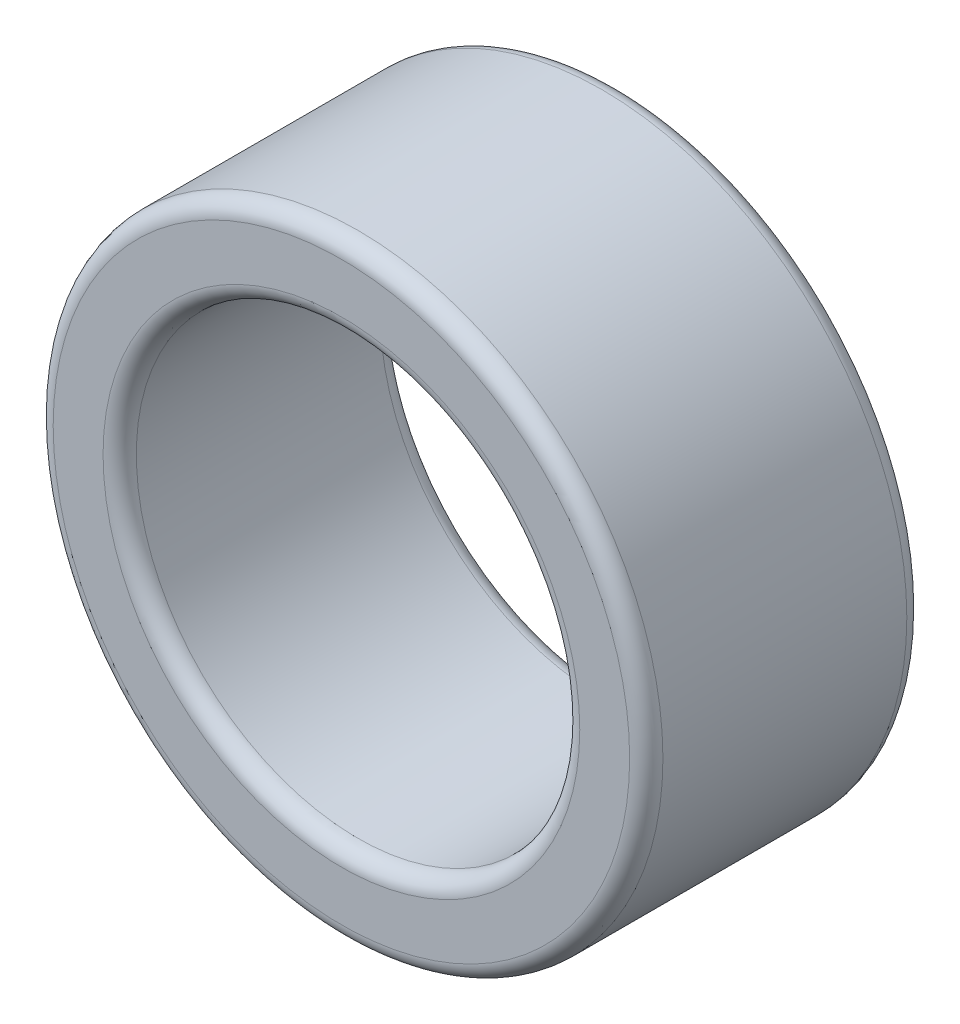
ISO-10303-21;
HEADER;
FILE_DESCRIPTION(('STEP AP214'),'2;1');
FILE_NAME('part.step','',(''),(''),'','','');
FILE_SCHEMA(('AUTOMOTIVE_DESIGN { 1 0 10303 214 1 1 1 1 }'));
ENDSEC;
DATA;
#1=APPLICATION_CONTEXT('core data for automotive mechanical design processes');
#2=APPLICATION_PROTOCOL_DEFINITION('international standard','automotive_design',2000,#1);
#3=PRODUCT_CONTEXT('',#1,'mechanical');
#4=PRODUCT('Part','Part','',(#3));
#5=PRODUCT_RELATED_PRODUCT_CATEGORY('part','',(#4));
#6=PRODUCT_DEFINITION_FORMATION('','',#4);
#7=PRODUCT_DEFINITION_CONTEXT('part definition',#1,'design');
#8=PRODUCT_DEFINITION('design','',#6,#7);
#9=PRODUCT_DEFINITION_SHAPE('','',#8);
#10=(LENGTH_UNIT() NAMED_UNIT(*) SI_UNIT(.MILLI.,.METRE.));
#11=(NAMED_UNIT(*) PLANE_ANGLE_UNIT() SI_UNIT($,.RADIAN.));
#12=(NAMED_UNIT(*) SI_UNIT($,.STERADIAN.) SOLID_ANGLE_UNIT());
#13=UNCERTAINTY_MEASURE_WITH_UNIT(LENGTH_MEASURE(1.E-05),#10,'distance_accuracy_value','');
#14=(GEOMETRIC_REPRESENTATION_CONTEXT(3) GLOBAL_UNCERTAINTY_ASSIGNED_CONTEXT((#13)) GLOBAL_UNIT_ASSIGNED_CONTEXT((#10,
#11,#12)) REPRESENTATION_CONTEXT('',''));
#15=CARTESIAN_POINT('',(0.,0.,0.));
#16=DIRECTION('',(0.,0.,1.));
#17=DIRECTION('',(1.,0.,0.));
#18=AXIS2_PLACEMENT_3D('',#15,#16,#17);
#19=CARTESIAN_POINT('',(0.,0.,5.));
#20=DIRECTION('',(0.,0.,1.));
#21=DIRECTION('',(1.,0.,0.));
#22=AXIS2_PLACEMENT_3D('',#19,#20,#21);
#23=PLANE('',#22);
#24=CARTESIAN_POINT('',(0.,0.,5.));
#25=DIRECTION('',(0.,0.,1.));
#26=DIRECTION('',(1.,0.,0.));
#27=AXIS2_PLACEMENT_3D('',#24,#25,#26);
#28=CIRCLE('',#27,4.3);
#29=CARTESIAN_POINT('',(4.3,0.,5.));
#30=VERTEX_POINT('',#29);
#31=EDGE_CURVE('E44',#30,#30,#28,.F.);
#32=ORIENTED_EDGE('',*,*,#31,.T.);
#33=EDGE_LOOP('',(#32));
#34=FACE_BOUND('',#33,.T.);
#35=CARTESIAN_POINT('',(0.,0.,5.));
#36=DIRECTION('',(0.,0.,1.));
#37=DIRECTION('',(1.,0.,0.));
#38=AXIS2_PLACEMENT_3D('',#35,#36,#37);
#39=CIRCLE('',#38,5.2);
#40=CARTESIAN_POINT('',(5.2,0.,5.));
#41=VERTEX_POINT('',#40);
#42=EDGE_CURVE('E49',#41,#41,#39,.T.);
#43=ORIENTED_EDGE('',*,*,#42,.T.);
#44=EDGE_LOOP('',(#43));
#45=FACE_BOUND('',#44,.T.);
#46=ADVANCED_FACE('F36',(#34,#45),#23,.T.);
#47=CARTESIAN_POINT('',(0.,0.,0.));
#48=DIRECTION('',(0.,0.,1.));
#49=DIRECTION('',(1.,0.,0.));
#50=AXIS2_PLACEMENT_3D('',#47,#48,#49);
#51=PLANE('',#50);
#52=CARTESIAN_POINT('',(0.,0.,0.));
#53=DIRECTION('',(0.,0.,1.));
#54=DIRECTION('',(1.,0.,0.));
#55=AXIS2_PLACEMENT_3D('',#52,#53,#54);
#56=CIRCLE('',#55,4.3);
#57=CARTESIAN_POINT('',(4.3,0.,0.));
#58=VERTEX_POINT('',#57);
#59=EDGE_CURVE('E64',#58,#58,#56,.T.);
#60=ORIENTED_EDGE('',*,*,#59,.T.);
#61=EDGE_LOOP('',(#60));
#62=FACE_BOUND('',#61,.T.);
#63=CARTESIAN_POINT('',(0.,0.,0.));
#64=DIRECTION('',(0.,0.,1.));
#65=DIRECTION('',(1.,0.,0.));
#66=AXIS2_PLACEMENT_3D('',#63,#64,#65);
#67=CIRCLE('',#66,5.2);
#68=CARTESIAN_POINT('',(5.2,0.,0.));
#69=VERTEX_POINT('',#68);
#70=EDGE_CURVE('E68',#69,#69,#67,.F.);
#71=ORIENTED_EDGE('',*,*,#70,.T.);
#72=EDGE_LOOP('',(#71));
#73=FACE_BOUND('',#72,.T.);
#74=ADVANCED_FACE('F98',(#62,#73),#51,.F.);
#75=CARTESIAN_POINT('',(0.,0.,5.));
#76=DIRECTION('',(0.,0.,-1.));
#77=DIRECTION('',(-1.,0.,0.));
#78=AXIS2_PLACEMENT_3D('',#75,#76,#77);
#79=CYLINDRICAL_SURFACE('',#78,5.5);
#80=CARTESIAN_POINT('',(0.,0.,4.7));
#81=DIRECTION('',(0.,0.,1.));
#82=DIRECTION('',(1.,0.,0.));
#83=AXIS2_PLACEMENT_3D('',#80,#81,#82);
#84=CIRCLE('',#83,5.5);
#85=CARTESIAN_POINT('',(5.5,0.,4.7));
#86=VERTEX_POINT('',#85);
#87=EDGE_CURVE('E10',#86,#86,#84,.F.);
#88=ORIENTED_EDGE('',*,*,#87,.T.);
#89=EDGE_LOOP('',(#88));
#90=FACE_BOUND('',#89,.T.);
#91=CARTESIAN_POINT('',(0.,0.,0.3));
#92=DIRECTION('',(0.,0.,1.));
#93=DIRECTION('',(1.,0.,0.));
#94=AXIS2_PLACEMENT_3D('',#91,#92,#93);
#95=CIRCLE('',#94,5.5);
#96=CARTESIAN_POINT('',(5.5,0.,0.3));
#97=VERTEX_POINT('',#96);
#98=EDGE_CURVE('E72',#97,#97,#95,.T.);
#99=ORIENTED_EDGE('',*,*,#98,.T.);
#100=EDGE_LOOP('',(#99));
#101=FACE_BOUND('',#100,.T.);
#102=ADVANCED_FACE('F77',(#90,#101),#79,.T.);
#103=CARTESIAN_POINT('',(0.,0.,5.));
#104=DIRECTION('',(0.,0.,-1.));
#105=DIRECTION('',(-1.,0.,0.));
#106=AXIS2_PLACEMENT_3D('',#103,#104,#105);
#107=CYLINDRICAL_SURFACE('',#106,4.);
#108=CARTESIAN_POINT('',(0.,0.,4.7));
#109=DIRECTION('',(0.,0.,1.));
#110=DIRECTION('',(1.,0.,0.));
#111=AXIS2_PLACEMENT_3D('',#108,#109,#110);
#112=CIRCLE('',#111,4.);
#113=CARTESIAN_POINT('',(4.,0.,4.7));
#114=VERTEX_POINT('',#113);
#115=EDGE_CURVE('E54',#114,#114,#112,.T.);
#116=ORIENTED_EDGE('',*,*,#115,.T.);
#117=EDGE_LOOP('',(#116));
#118=FACE_BOUND('',#117,.T.);
#119=CARTESIAN_POINT('',(0.,0.,0.3));
#120=DIRECTION('',(0.,0.,1.));
#121=DIRECTION('',(1.,0.,0.));
#122=AXIS2_PLACEMENT_3D('',#119,#120,#121);
#123=CIRCLE('',#122,4.);
#124=CARTESIAN_POINT('',(4.,0.,0.3));
#125=VERTEX_POINT('',#124);
#126=EDGE_CURVE('E60',#125,#125,#123,.F.);
#127=ORIENTED_EDGE('',*,*,#126,.T.);
#128=EDGE_LOOP('',(#127));
#129=FACE_BOUND('',#128,.T.);
#130=ADVANCED_FACE('F82',(#118,#129),#107,.F.);
#131=CARTESIAN_POINT('',(0.,0.,0.3));
#132=DIRECTION('',(0.,0.,1.));
#133=DIRECTION('',(1.,0.,0.));
#134=AXIS2_PLACEMENT_3D('',#131,#132,#133);
#135=TOROIDAL_SURFACE('',#134,5.2,0.3);
#136=ORIENTED_EDGE('',*,*,#70,.F.);
#137=EDGE_LOOP('',(#136));
#138=FACE_BOUND('',#137,.T.);
#139=ORIENTED_EDGE('',*,*,#98,.F.);
#140=EDGE_LOOP('',(#139));
#141=FACE_BOUND('',#140,.T.);
#142=ADVANCED_FACE('F79',(#138,#141),#135,.T.);
#143=CARTESIAN_POINT('',(0.,0.,0.3));
#144=DIRECTION('',(0.,0.,1.));
#145=DIRECTION('',(1.,0.,0.));
#146=AXIS2_PLACEMENT_3D('',#143,#144,#145);
#147=TOROIDAL_SURFACE('',#146,4.3,0.3);
#148=ORIENTED_EDGE('',*,*,#126,.F.);
#149=EDGE_LOOP('',(#148));
#150=FACE_BOUND('',#149,.T.);
#151=ORIENTED_EDGE('',*,*,#59,.F.);
#152=EDGE_LOOP('',(#151));
#153=FACE_BOUND('',#152,.T.);
#154=ADVANCED_FACE('F81',(#150,#153),#147,.T.);
#155=CARTESIAN_POINT('',(0.,0.,4.7));
#156=DIRECTION('',(0.,0.,1.));
#157=DIRECTION('',(1.,0.,0.));
#158=AXIS2_PLACEMENT_3D('',#155,#156,#157);
#159=TOROIDAL_SURFACE('',#158,4.3,0.3);
#160=ORIENTED_EDGE('',*,*,#31,.F.);
#161=EDGE_LOOP('',(#160));
#162=FACE_BOUND('',#161,.T.);
#163=ORIENTED_EDGE('',*,*,#115,.F.);
#164=EDGE_LOOP('',(#163));
#165=FACE_BOUND('',#164,.T.);
#166=ADVANCED_FACE('F89',(#162,#165),#159,.T.);
#167=CARTESIAN_POINT('',(0.,0.,4.7));
#168=DIRECTION('',(0.,0.,1.));
#169=DIRECTION('',(1.,0.,0.));
#170=AXIS2_PLACEMENT_3D('',#167,#168,#169);
#171=TOROIDAL_SURFACE('',#170,5.2,0.3);
#172=ORIENTED_EDGE('',*,*,#87,.F.);
#173=EDGE_LOOP('',(#172));
#174=FACE_BOUND('',#173,.T.);
#175=ORIENTED_EDGE('',*,*,#42,.F.);
#176=EDGE_LOOP('',(#175));
#177=FACE_BOUND('',#176,.T.);
#178=ADVANCED_FACE('F38',(#174,#177),#171,.T.);
#179=CLOSED_SHELL('',(#46,#74,#102,#130,#142,#154,#166,#178));
#180=MANIFOLD_SOLID_BREP('B2',#179);
#181=ADVANCED_BREP_SHAPE_REPRESENTATION('',(#18,#180),#14);
#182=SHAPE_DEFINITION_REPRESENTATION(#9,#181);
ENDSEC;
END-ISO-10303-21;
